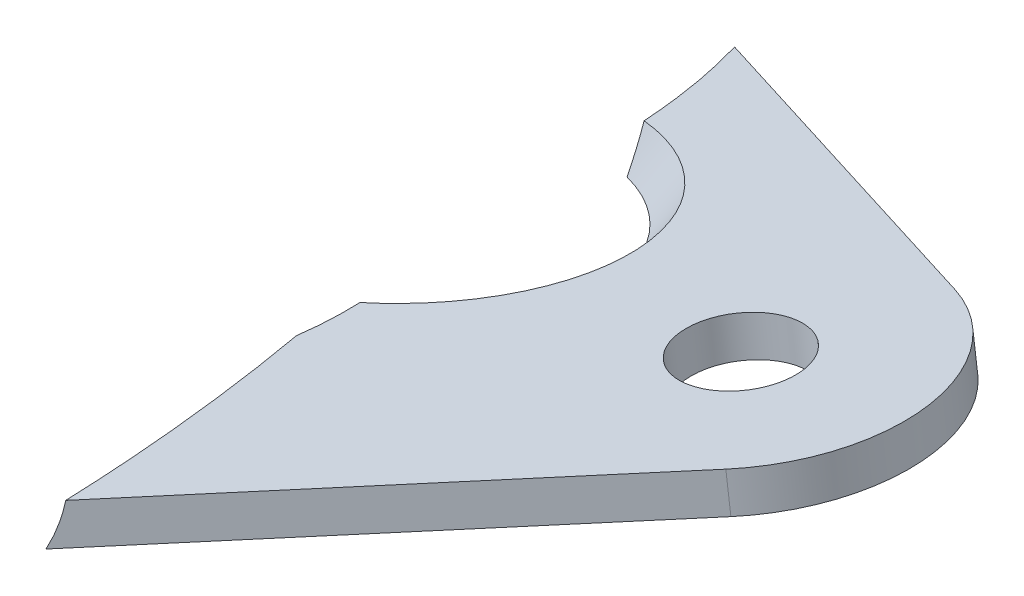
ISO-10303-21;
HEADER;
FILE_DESCRIPTION(('STEP AP214'),'2;1');
FILE_NAME('part.step','',(''),(''),'','','');
FILE_SCHEMA(('AUTOMOTIVE_DESIGN { 1 0 10303 214 1 1 1 1 }'));
ENDSEC;
DATA;
#1=APPLICATION_CONTEXT('core data for automotive mechanical design processes');
#2=APPLICATION_PROTOCOL_DEFINITION('international standard','automotive_design',2000,#1);
#3=PRODUCT_CONTEXT('',#1,'mechanical');
#4=PRODUCT('Part','Part','',(#3));
#5=PRODUCT_RELATED_PRODUCT_CATEGORY('part','',(#4));
#6=PRODUCT_DEFINITION_FORMATION('','',#4);
#7=PRODUCT_DEFINITION_CONTEXT('part definition',#1,'design');
#8=PRODUCT_DEFINITION('design','',#6,#7);
#9=PRODUCT_DEFINITION_SHAPE('','',#8);
#10=(LENGTH_UNIT() NAMED_UNIT(*) SI_UNIT(.MILLI.,.METRE.));
#11=(NAMED_UNIT(*) PLANE_ANGLE_UNIT() SI_UNIT($,.RADIAN.));
#12=(NAMED_UNIT(*) SI_UNIT($,.STERADIAN.) SOLID_ANGLE_UNIT());
#13=UNCERTAINTY_MEASURE_WITH_UNIT(LENGTH_MEASURE(1.E-05),#10,'distance_accuracy_value','');
#14=(GEOMETRIC_REPRESENTATION_CONTEXT(3) GLOBAL_UNCERTAINTY_ASSIGNED_CONTEXT((#13)) GLOBAL_UNIT_ASSIGNED_CONTEXT((#10,
#11,#12)) REPRESENTATION_CONTEXT('',''));
#15=CARTESIAN_POINT('',(0.,0.,0.));
#16=DIRECTION('',(0.,0.,1.));
#17=DIRECTION('',(1.,0.,0.));
#18=AXIS2_PLACEMENT_3D('',#15,#16,#17);
#19=CARTESIAN_POINT('',(-33.7858293990203,257.874725999246,6.49143313817038E-13));
#20=DIRECTION('',(0.129906246779412,-0.991526281571843,0.));
#21=DIRECTION('',(0.991526281571843,0.129906246779412,0.));
#22=AXIS2_PLACEMENT_3D('',#19,#20,#21);
#23=PLANE('',#22);
#24=CARTESIAN_POINT('',(233.332473747755,292.871615998845,371.355125180907));
#25=DIRECTION('',(-0.129906246779409,0.991526281571844,0.));
#26=DIRECTION('',(-0.991526281571844,-0.129906246779409,0.));
#27=AXIS2_PLACEMENT_3D('',#24,#25,#26);
#28=CIRCLE('',#27,4.25000000000003);
#29=CARTESIAN_POINT('',(229.118487051075,292.319514450032,371.355125180907));
#30=VERTEX_POINT('',#29);
#31=EDGE_CURVE('E193',#30,#30,#28,.T.);
#32=ORIENTED_EDGE('',*,*,#31,.F.);
#33=EDGE_LOOP('',(#32));
#34=FACE_BOUND('',#33,.T.);
#35=CARTESIAN_POINT('',(199.998588282387,288.504328886177,379.576493896457));
#36=DIRECTION('',(0.129906246779412,-0.991526281571843,0.));
#37=DIRECTION('',(0.142888835310669,0.0187207869795058,0.989561677147225));
#38=AXIS2_PLACEMENT_3D('',#35,#36,#37);
#39=ELLIPSE('',#38,17.1539828197814,12.7);
#40=CARTESIAN_POINT('',(212.404687655638,290.129731900403,384.65909611208));
#41=VERTEX_POINT('',#40);
#42=CARTESIAN_POINT('',(212.675383860231,290.165197554325,380.03266963168));
#43=VERTEX_POINT('',#42);
#44=EDGE_CURVE('E94',#41,#43,#39,.F.);
#45=ORIENTED_EDGE('',*,*,#44,.F.);
#46=CARTESIAN_POINT('',(201.661367681705,288.72218032895,397.585062298254));
#47=DIRECTION('',(0.129906246779412,-0.991526281571843,0.));
#48=DIRECTION('',(-0.107119544037454,-0.0140344216600745,-0.994147090874321));
#49=AXIS2_PLACEMENT_3D('',#46,#47,#48);
#50=ELLIPSE('',#49,40.7877661939587,12.7);
#51=CARTESIAN_POINT('',(214.82218604453,290.446463940827,404.851162958751));
#52=VERTEX_POINT('',#51);
#53=EDGE_CURVE('E196',#52,#41,#50,.F.);
#54=ORIENTED_EDGE('',*,*,#53,.F.);
#55=DIRECTION('',(0.742301569682693,0.0972537114629753,-0.662970659421129));
#56=VECTOR('',#55,1.);
#57=CARTESIAN_POINT('',(202.937342274222,288.889353981711,415.465855198842));
#58=LINE('',#57,#56);
#59=CARTESIAN_POINT('',(241.680854723389,293.965391180991,380.862921504798));
#60=VERTEX_POINT('',#59);
#61=EDGE_CURVE('E165',#52,#60,#58,.T.);
#62=ORIENTED_EDGE('',*,*,#61,.T.);
#63=CARTESIAN_POINT('',(233.332473747755,292.871615998845,371.355125180907));
#64=DIRECTION('',(-0.129906246779409,0.991526281571844,0.));
#65=DIRECTION('',(-0.991526281571844,-0.129906246779409,0.));
#66=AXIS2_PLACEMENT_3D('',#63,#64,#65);
#67=CIRCLE('',#66,12.7);
#68=CARTESIAN_POINT('',(237.994619839295,293.482433797572,359.557612924592));
#69=VERTEX_POINT('',#68);
#70=EDGE_CURVE('E168',#60,#69,#67,.T.);
#71=ORIENTED_EDGE('',*,*,#70,.T.);
#72=DIRECTION('',(0.92106641411826,0.120674845555271,0.370235387873097));
#73=VECTOR('',#72,1.);
#74=CARTESIAN_POINT('',(202.937342274222,288.889353981711,345.465855198842));
#75=LINE('',#74,#73);
#76=CARTESIAN_POINT('',(209.658670308436,289.769958474528,348.167585990049));
#77=VERTEX_POINT('',#76);
#78=EDGE_CURVE('E192',#77,#69,#75,.T.);
#79=ORIENTED_EDGE('',*,*,#78,.F.);
#80=CARTESIAN_POINT('',(198.830813631314,288.351331204901,359.573219167112));
#81=DIRECTION('',(0.129906246779412,-0.991526281571843,0.));
#82=DIRECTION('',(0.00593534632072545,0.00077762796426998,0.999982083318897));
#83=AXIS2_PLACEMENT_3D('',#80,#81,#82);
#84=ELLIPSE('',#83,22.6182252058801,12.7);
#85=CARTESIAN_POINT('',(211.316674196546,289.987184246808,356.794607128175));
#86=VERTEX_POINT('',#85);
#87=EDGE_CURVE('E211',#86,#77,#84,.F.);
#88=ORIENTED_EDGE('',*,*,#87,.F.);
#89=CARTESIAN_POINT('',(205.16438761706,289.18113354144,369.618643487689));
#90=DIRECTION('',(0.129906246779412,-0.991526281571843,0.));
#91=DIRECTION('',(-0.927723467355116,-0.12154702899275,0.352924195630786));
#92=AXIS2_PLACEMENT_3D('',#89,#90,#91);
#93=ELLIPSE('',#92,16.2653866656495,12.7);
#94=EDGE_CURVE('E88',#43,#86,#93,.F.);
#95=ORIENTED_EDGE('',*,*,#94,.F.);
#96=EDGE_LOOP('',(#45,#54,#62,#71,#79,#88,#95));
#97=FACE_BOUND('',#96,.T.);
#98=ADVANCED_FACE('F85',(#34,#97),#23,.F.);
#99=CARTESIAN_POINT('',(-33.3961106586821,254.90014715453,6.52885748250026E-13));
#100=DIRECTION('',(0.129906246779412,-0.991526281571843,0.));
#101=DIRECTION('',(0.991526281571843,0.129906246779412,0.));
#102=AXIS2_PLACEMENT_3D('',#99,#100,#101);
#103=PLANE('',#102);
#104=CARTESIAN_POINT('',(233.722192488093,289.897037154129,371.355125180907));
#105=DIRECTION('',(-0.129906246779409,0.991526281571844,0.));
#106=DIRECTION('',(-0.991526281571844,-0.129906246779409,0.));
#107=AXIS2_PLACEMENT_3D('',#104,#105,#106);
#108=CIRCLE('',#107,4.25000000000003);
#109=CARTESIAN_POINT('',(229.508205791413,289.344935605317,371.355125180907));
#110=VERTEX_POINT('',#109);
#111=EDGE_CURVE('E182',#110,#110,#108,.T.);
#112=ORIENTED_EDGE('',*,*,#111,.T.);
#113=EDGE_LOOP('',(#112));
#114=FACE_BOUND('',#113,.T.);
#115=CARTESIAN_POINT('',(201.070305340055,285.619103035286,388.48270223684));
#116=DIRECTION('',(0.129906246779412,-0.991526281571843,0.));
#117=DIRECTION('',(-0.107119544037454,-0.0140344216600745,-0.994147090874321));
#118=AXIS2_PLACEMENT_3D('',#115,#116,#117);
#119=ELLIPSE('',#118,40.7877661939587,12.7);
#120=CARTESIAN_POINT('',(214.204052052907,287.339839815871,405.751304919374));
#121=VERTEX_POINT('',#120);
#122=CARTESIAN_POINT('',(212.634898116898,287.134254848297,380.058365206203));
#123=VERTEX_POINT('',#122);
#124=EDGE_CURVE('E151',#121,#123,#119,.F.);
#125=ORIENTED_EDGE('',*,*,#124,.T.);
#126=CARTESIAN_POINT('',(199.99909052709,285.478756280558,376.881015783301));
#127=DIRECTION('',(0.129906246779412,-0.991526281571843,0.));
#128=DIRECTION('',(0.142888835310669,0.0187207869795058,0.989561677147225));
#129=AXIS2_PLACEMENT_3D('',#126,#127,#128);
#130=ELLIPSE('',#129,17.1539828197814,12.7);
#131=CARTESIAN_POINT('',(212.660854481407,287.137655558855,379.671173801174));
#132=VERTEX_POINT('',#131);
#133=EDGE_CURVE('E140',#123,#132,#130,.F.);
#134=ORIENTED_EDGE('',*,*,#133,.T.);
#135=CARTESIAN_POINT('',(203.32706101456,285.914775136996,370.465855198842));
#136=DIRECTION('',(0.129906246779412,-0.991526281571843,0.));
#137=DIRECTION('',(-0.927723467355116,-0.12154702899275,0.352924195630786));
#138=AXIS2_PLACEMENT_3D('',#135,#136,#137);
#139=ELLIPSE('',#138,16.2653866656495,12.7);
#140=CARTESIAN_POINT('',(211.39329784063,286.971584796189,358.185250537415));
#141=VERTEX_POINT('',#140);
#142=EDGE_CURVE('E148',#132,#141,#139,.F.);
#143=ORIENTED_EDGE('',*,*,#142,.T.);
#144=CARTESIAN_POINT('',(199.24677334963,285.380190359787,363.99427674464));
#145=DIRECTION('',(0.129906246779412,-0.991526281571843,0.));
#146=DIRECTION('',(0.00593534632072545,0.00077762796426998,0.999982083318897));
#147=AXIS2_PLACEMENT_3D('',#144,#145,#146);
#148=ELLIPSE('',#147,22.6182252058801,12.7);
#149=CARTESIAN_POINT('',(207.60399290894,286.475123541729,347.185027144047));
#150=VERTEX_POINT('',#149);
#151=EDGE_CURVE('E157',#141,#150,#148,.F.);
#152=ORIENTED_EDGE('',*,*,#151,.T.);
#153=DIRECTION('',(0.92106641411826,0.120674845555271,0.370235387873097));
#154=VECTOR('',#153,1.);
#155=CARTESIAN_POINT('',(203.32706101456,285.914775136996,345.465855198842));
#156=LINE('',#155,#154);
#157=CARTESIAN_POINT('',(238.384338579634,290.507854952856,359.557612924592));
#158=VERTEX_POINT('',#157);
#159=EDGE_CURVE('E158',#150,#158,#156,.T.);
#160=ORIENTED_EDGE('',*,*,#159,.T.);
#161=CARTESIAN_POINT('',(233.722192488093,289.897037154129,371.355125180907));
#162=DIRECTION('',(-0.129906246779409,0.991526281571844,0.));
#163=DIRECTION('',(-0.991526281571844,-0.129906246779409,0.));
#164=AXIS2_PLACEMENT_3D('',#161,#162,#163);
#165=CIRCLE('',#164,12.7);
#166=CARTESIAN_POINT('',(242.070573463727,290.990812336276,380.862921504798));
#167=VERTEX_POINT('',#166);
#168=EDGE_CURVE('E177',#167,#158,#165,.T.);
#169=ORIENTED_EDGE('',*,*,#168,.F.);
#170=DIRECTION('',(0.742301569682693,0.0972537114629753,-0.662970659421129));
#171=VECTOR('',#170,1.);
#172=CARTESIAN_POINT('',(203.32706101456,285.914775136996,415.465855198842));
#173=LINE('',#172,#171);
#174=EDGE_CURVE('E169',#121,#167,#173,.T.);
#175=ORIENTED_EDGE('',*,*,#174,.F.);
#176=EDGE_LOOP('',(#125,#134,#143,#152,#160,#169,#175));
#177=FACE_BOUND('',#176,.T.);
#178=ADVANCED_FACE('F146',(#114,#177),#103,.T.);
#179=CARTESIAN_POINT('',(233.722192488093,289.897037154129,371.355125180907));
#180=DIRECTION('',(-0.129906246779409,0.991526281571844,0.));
#181=DIRECTION('',(-0.991526281571844,-0.129906246779409,0.));
#182=AXIS2_PLACEMENT_3D('',#179,#180,#181);
#183=CYLINDRICAL_SURFACE('',#182,12.7);
#184=ORIENTED_EDGE('',*,*,#70,.F.);
#185=DIRECTION('',(-0.129906246779409,0.991526281571844,0.));
#186=VECTOR('',#185,1.);
#187=CARTESIAN_POINT('',(242.070573463727,290.990812336276,380.862921504798));
#188=LINE('',#187,#186);
#189=EDGE_CURVE('E189',#167,#60,#188,.T.);
#190=ORIENTED_EDGE('',*,*,#189,.F.);
#191=ORIENTED_EDGE('',*,*,#168,.T.);
#192=DIRECTION('',(-0.129906246779409,0.991526281571844,0.));
#193=VECTOR('',#192,1.);
#194=CARTESIAN_POINT('',(238.384338579634,290.507854952856,359.557612924592));
#195=LINE('',#194,#193);
#196=EDGE_CURVE('E173',#158,#69,#195,.T.);
#197=ORIENTED_EDGE('',*,*,#196,.T.);
#198=EDGE_LOOP('',(#184,#190,#191,#197));
#199=FACE_BOUND('',#198,.T.);
#200=ADVANCED_FACE('F223',(#199),#183,.T.);
#201=CARTESIAN_POINT('',(203.32706101456,285.914775136996,415.465855198842));
#202=DIRECTION('',(0.657352832727065,0.0861240300902696,0.748645379833946));
#203=DIRECTION('',(0.751437403393875,0.,-0.659804386754643));
#204=AXIS2_PLACEMENT_3D('',#201,#202,#203);
#205=PLANE('',#204);
#206=ORIENTED_EDGE('',*,*,#61,.F.);
#207=CARTESIAN_POINT('',(202.788034235581,294.637179736797,414.935727227942));
#208=DIRECTION('',(0.657352832727065,0.0861240300902696,0.748645379833946));
#209=DIRECTION('',(0.709863175585508,-0.404225892914895,-0.576797797711481));
#210=AXIS2_PLACEMENT_3D('',#207,#208,#209);
#211=ELLIPSE('',#210,16.3801337908073,12.7);
#212=EDGE_CURVE('E176',#52,#121,#211,.F.);
#213=ORIENTED_EDGE('',*,*,#212,.T.);
#214=ORIENTED_EDGE('',*,*,#174,.T.);
#215=ORIENTED_EDGE('',*,*,#189,.T.);
#216=EDGE_LOOP('',(#206,#213,#214,#215));
#217=FACE_BOUND('',#216,.T.);
#218=ADVANCED_FACE('F217',(#217),#205,.T.);
#219=CARTESIAN_POINT('',(203.32706101456,285.914775136996,345.465855198842));
#220=DIRECTION('',(-0.367098117444121,-0.0480958896635116,0.92893797293816));
#221=DIRECTION('',(0.930014256997446,0.,0.36752344385289));
#222=AXIS2_PLACEMENT_3D('',#219,#220,#221);
#223=PLANE('',#222);
#224=CARTESIAN_POINT('',(197.344656615038,298.966738464014,343.777493165557));
#225=DIRECTION('',(-0.367098117444121,-0.0480958896635116,0.92893797293816));
#226=DIRECTION('',(0.55987427699959,-0.808929903536508,0.179368907892651));
#227=AXIS2_PLACEMENT_3D('',#224,#225,#226);
#228=ELLIPSE('',#227,16.5616760487844,12.7);
#229=EDGE_CURVE('E210',#77,#150,#228,.F.);
#230=ORIENTED_EDGE('',*,*,#229,.F.);
#231=ORIENTED_EDGE('',*,*,#78,.T.);
#232=ORIENTED_EDGE('',*,*,#196,.F.);
#233=ORIENTED_EDGE('',*,*,#159,.F.);
#234=EDGE_LOOP('',(#230,#231,#232,#233));
#235=FACE_BOUND('',#234,.T.);
#236=ADVANCED_FACE('F239',(#235),#223,.F.);
#237=CARTESIAN_POINT('',(233.722192488093,289.897037154129,371.355125180907));
#238=DIRECTION('',(-0.129906246779409,0.991526281571844,0.));
#239=DIRECTION('',(-0.991526281571844,-0.129906246779409,0.));
#240=AXIS2_PLACEMENT_3D('',#237,#238,#239);
#241=CYLINDRICAL_SURFACE('',#240,4.25000000000003);
#242=ORIENTED_EDGE('',*,*,#111,.F.);
#243=EDGE_LOOP('',(#242));
#244=FACE_BOUND('',#243,.T.);
#245=ORIENTED_EDGE('',*,*,#31,.T.);
#246=EDGE_LOOP('',(#245));
#247=FACE_BOUND('',#246,.T.);
#248=ADVANCED_FACE('F231',(#244,#247),#241,.F.);
#249=CARTESIAN_POINT('',(220.,385.,680.000000000019));
#250=DIRECTION('',(-0.0613459413562254,-0.322066192120178,-0.944727496885915));
#251=DIRECTION('',(0.,0.946510188178546,-0.32267392778812));
#252=AXIS2_PLACEMENT_3D('',#249,#250,#251);
#253=CYLINDRICAL_SURFACE('',#252,12.7);
#254=ORIENTED_EDGE('',*,*,#53,.T.);
#255=CARTESIAN_POINT('',(200.,280.,372.));
#256=DIRECTION('',(-0.120046386986745,0.829209332016738,-0.545894448284449));
#257=DIRECTION('',(-0.0316664396943713,-0.55278944328689,-0.832719081075757));
#258=AXIS2_PLACEMENT_3D('',#255,#256,#257);
#259=ELLIPSE('',#258,49.6044218677506,12.7);
#260=EDGE_CURVE('E102',#41,#123,#259,.T.);
#261=ORIENTED_EDGE('',*,*,#260,.T.);
#262=ORIENTED_EDGE('',*,*,#124,.F.);
#263=ORIENTED_EDGE('',*,*,#212,.F.);
#264=EDGE_LOOP('',(#254,#261,#262,#263));
#265=FACE_BOUND('',#264,.T.);
#266=ADVANCED_FACE('F229',(#265),#253,.F.);
#267=CARTESIAN_POINT('',(214.345830401329,305.503698491249,365.384978203832));
#268=DIRECTION('',(-0.47819434671095,-0.850123283041637,0.220500726538934));
#269=DIRECTION('',(0.871575537124536,-0.490261239632582,0.));
#270=AXIS2_PLACEMENT_3D('',#267,#268,#269);
#271=CYLINDRICAL_SURFACE('',#270,12.7);
#272=CARTESIAN_POINT('',(200.,280.,372.));
#273=DIRECTION('',(-0.472688784467576,-0.102241865874699,0.875278192291471));
#274=DIRECTION('',(0.27712298038636,0.92560925063082,0.257779690605044));
#275=AXIS2_PLACEMENT_3D('',#272,#273,#274);
#276=ELLIPSE('',#275,25.101057822729,12.7);
#277=EDGE_CURVE('E12',#43,#132,#276,.F.);
#278=ORIENTED_EDGE('',*,*,#277,.F.);
#279=ORIENTED_EDGE('',*,*,#94,.T.);
#280=CARTESIAN_POINT('',(200.,280.,372.));
#281=DIRECTION('',(0.636137571343475,0.336381281134064,0.694389389339894));
#282=DIRECTION('',(-0.222550988478309,-0.781719743239746,0.582567850603269));
#283=AXIS2_PLACEMENT_3D('',#280,#281,#282);
#284=ELLIPSE('',#283,29.0584877515781,12.7);
#285=EDGE_CURVE('E156',#141,#86,#284,.T.);
#286=ORIENTED_EDGE('',*,*,#285,.F.);
#287=ORIENTED_EDGE('',*,*,#142,.F.);
#288=EDGE_LOOP('',(#278,#279,#286,#287));
#289=FACE_BOUND('',#288,.T.);
#290=ADVANCED_FACE('F154',(#289),#271,.F.);
#291=CARTESIAN_POINT('',(165.,530.,1.18016707517654E-10));
#292=DIRECTION('',(0.0778529758565297,-0.556092684689497,0.82746591481771));
#293=DIRECTION('',(0.,-0.829985043082567,-0.557785647233084));
#294=AXIS2_PLACEMENT_3D('',#291,#292,#293);
#295=CYLINDRICAL_SURFACE('',#294,12.7);
#296=ORIENTED_EDGE('',*,*,#87,.T.);
#297=ORIENTED_EDGE('',*,*,#229,.T.);
#298=ORIENTED_EDGE('',*,*,#151,.F.);
#299=ORIENTED_EDGE('',*,*,#285,.T.);
#300=EDGE_LOOP('',(#296,#297,#298,#299));
#301=FACE_BOUND('',#300,.T.);
#302=ADVANCED_FACE('F237',(#301),#295,.F.);
#303=CARTESIAN_POINT('',(200.,280.,372.));
#304=DIRECTION('',(-0.000123946098419014,0.746663763066129,0.665201630756639));
#305=DIRECTION('',(0.,-0.665201635866264,0.746663768801491));
#306=AXIS2_PLACEMENT_3D('',#303,#304,#305);
#307=CYLINDRICAL_SURFACE('',#306,12.7);
#308=ORIENTED_EDGE('',*,*,#44,.T.);
#309=ORIENTED_EDGE('',*,*,#277,.T.);
#310=ORIENTED_EDGE('',*,*,#133,.F.);
#311=ORIENTED_EDGE('',*,*,#260,.F.);
#312=EDGE_LOOP('',(#308,#309,#310,#311));
#313=FACE_BOUND('',#312,.T.);
#314=ADVANCED_FACE('F139',(#313),#307,.F.);
#315=CLOSED_SHELL('',(#98,#178,#200,#218,#236,#248,#266,#290,#302,#314));
#316=MANIFOLD_SOLID_BREP('B2',#315);
#317=ADVANCED_BREP_SHAPE_REPRESENTATION('',(#18,#316),#14);
#318=SHAPE_DEFINITION_REPRESENTATION(#9,#317);
ENDSEC;
END-ISO-10303-21;
